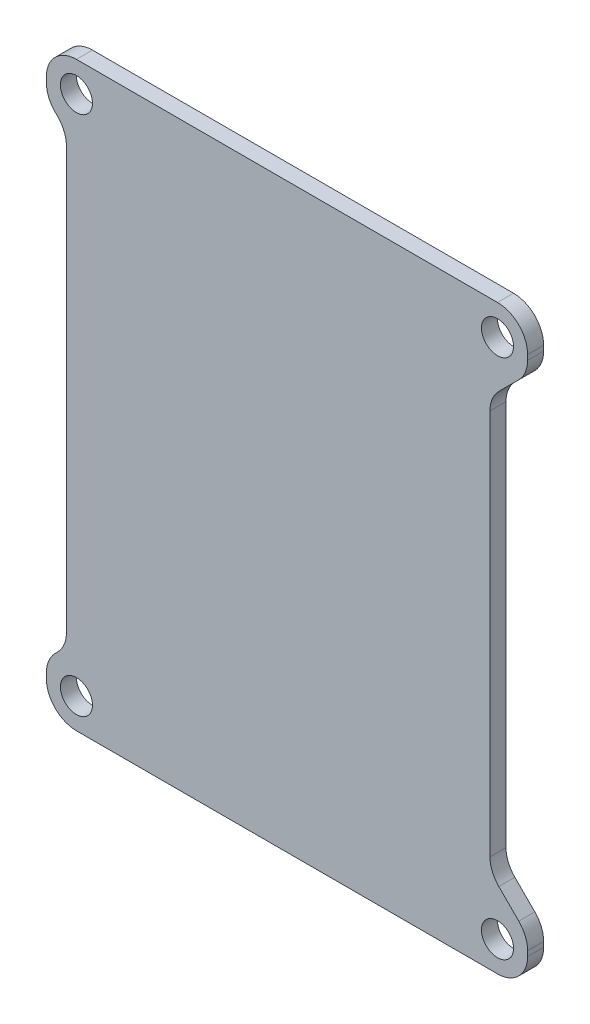
ISO-10303-21;
HEADER;
FILE_DESCRIPTION(('STEP AP214'),'2;1');
FILE_NAME('part.step','',(''),(''),'','','');
FILE_SCHEMA(('AUTOMOTIVE_DESIGN { 1 0 10303 214 1 1 1 1 }'));
ENDSEC;
DATA;
#1=APPLICATION_CONTEXT('core data for automotive mechanical design processes');
#2=APPLICATION_PROTOCOL_DEFINITION('international standard','automotive_design',2000,#1);
#3=PRODUCT_CONTEXT('',#1,'mechanical');
#4=PRODUCT('Part','Part','',(#3));
#5=PRODUCT_RELATED_PRODUCT_CATEGORY('part','',(#4));
#6=PRODUCT_DEFINITION_FORMATION('','',#4);
#7=PRODUCT_DEFINITION_CONTEXT('part definition',#1,'design');
#8=PRODUCT_DEFINITION('design','',#6,#7);
#9=PRODUCT_DEFINITION_SHAPE('','',#8);
#10=(LENGTH_UNIT() NAMED_UNIT(*) SI_UNIT(.MILLI.,.METRE.));
#11=(NAMED_UNIT(*) PLANE_ANGLE_UNIT() SI_UNIT($,.RADIAN.));
#12=(NAMED_UNIT(*) SI_UNIT($,.STERADIAN.) SOLID_ANGLE_UNIT());
#13=UNCERTAINTY_MEASURE_WITH_UNIT(LENGTH_MEASURE(1.E-05),#10,'distance_accuracy_value','');
#14=(GEOMETRIC_REPRESENTATION_CONTEXT(3) GLOBAL_UNCERTAINTY_ASSIGNED_CONTEXT((#13)) GLOBAL_UNIT_ASSIGNED_CONTEXT((#10,
#11,#12)) REPRESENTATION_CONTEXT('',''));
#15=CARTESIAN_POINT('',(0.,0.,0.));
#16=DIRECTION('',(0.,0.,1.));
#17=DIRECTION('',(1.,0.,0.));
#18=AXIS2_PLACEMENT_3D('',#15,#16,#17);
#19=CARTESIAN_POINT('',(-21.,26.,1.6));
#20=DIRECTION('',(0.,0.,-1.));
#21=DIRECTION('',(-1.,0.,0.));
#22=AXIS2_PLACEMENT_3D('',#19,#20,#21);
#23=PLANE('',#22);
#24=CARTESIAN_POINT('',(-21.,26.,1.6));
#25=DIRECTION('',(0.,0.,1.));
#26=DIRECTION('',(-1.,0.,0.));
#27=AXIS2_PLACEMENT_3D('',#24,#25,#26);
#28=CIRCLE('',#27,3.);
#29=CARTESIAN_POINT('',(-21.,29.,1.6));
#30=VERTEX_POINT('',#29);
#31=CARTESIAN_POINT('',(-24.,26.,1.6));
#32=VERTEX_POINT('',#31);
#33=EDGE_CURVE('E279',#30,#32,#28,.T.);
#34=ORIENTED_EDGE('',*,*,#33,.T.);
#35=DIRECTION('',(0.,-1.,0.));
#36=VECTOR('',#35,1.);
#37=CARTESIAN_POINT('',(-24.,26.,1.6));
#38=LINE('',#37,#36);
#39=CARTESIAN_POINT('',(-24.,25.5,1.6));
#40=VERTEX_POINT('',#39);
#41=EDGE_CURVE('E147',#32,#40,#38,.T.);
#42=ORIENTED_EDGE('',*,*,#41,.T.);
#43=CARTESIAN_POINT('',(-21.,25.5,1.6));
#44=DIRECTION('',(0.,0.,1.));
#45=DIRECTION('',(-1.,0.,0.));
#46=AXIS2_PLACEMENT_3D('',#43,#44,#45);
#47=CIRCLE('',#46,3.);
#48=CARTESIAN_POINT('',(-23.1213203435596,23.3786796564403,1.6));
#49=VERTEX_POINT('',#48);
#50=EDGE_CURVE('E342',#40,#49,#47,.T.);
#51=ORIENTED_EDGE('',*,*,#50,.T.);
#52=DIRECTION('',(0.707106781186558,-0.707106781186537,0.));
#53=VECTOR('',#52,1.);
#54=CARTESIAN_POINT('',(-23.1213203435596,23.3786796564403,1.6));
#55=LINE('',#54,#53);
#56=CARTESIAN_POINT('',(-22.8786796564404,23.1360389693211,1.6));
#57=VERTEX_POINT('',#56);
#58=EDGE_CURVE('E361',#49,#57,#55,.T.);
#59=ORIENTED_EDGE('',*,*,#58,.T.);
#60=CARTESIAN_POINT('',(-25.,21.0147186257614,1.6));
#61=DIRECTION('',(0.,0.,-1.));
#62=DIRECTION('',(-1.,0.,0.));
#63=AXIS2_PLACEMENT_3D('',#60,#61,#62);
#64=CIRCLE('',#63,3.);
#65=CARTESIAN_POINT('',(-22.,21.0147186257614,1.6));
#66=VERTEX_POINT('',#65);
#67=EDGE_CURVE('E358',#57,#66,#64,.T.);
#68=ORIENTED_EDGE('',*,*,#67,.T.);
#69=DIRECTION('',(0.,-1.,0.));
#70=VECTOR('',#69,1.);
#71=CARTESIAN_POINT('',(-22.,21.0147186257614,1.6));
#72=LINE('',#71,#70);
#73=CARTESIAN_POINT('',(-22.,-21.0147186257614,1.6));
#74=VERTEX_POINT('',#73);
#75=EDGE_CURVE('E360',#66,#74,#72,.T.);
#76=ORIENTED_EDGE('',*,*,#75,.T.);
#77=CARTESIAN_POINT('',(-25.,-21.0147186257614,1.6));
#78=DIRECTION('',(0.,0.,-1.));
#79=DIRECTION('',(1.,0.,0.));
#80=AXIS2_PLACEMENT_3D('',#77,#78,#79);
#81=CIRCLE('',#80,3.);
#82=CARTESIAN_POINT('',(-22.8786796564403,-23.136038969321,1.6));
#83=VERTEX_POINT('',#82);
#84=EDGE_CURVE('E363',#74,#83,#81,.T.);
#85=ORIENTED_EDGE('',*,*,#84,.T.);
#86=DIRECTION('',(-0.707106781186547,-0.707106781186547,0.));
#87=VECTOR('',#86,1.);
#88=CARTESIAN_POINT('',(-22.8786796564403,-23.136038969321,1.6));
#89=LINE('',#88,#87);
#90=CARTESIAN_POINT('',(-23.1213203435597,-23.3786796564404,1.6));
#91=VERTEX_POINT('',#90);
#92=EDGE_CURVE('E369',#83,#91,#89,.T.);
#93=ORIENTED_EDGE('',*,*,#92,.T.);
#94=CARTESIAN_POINT('',(-21.,-25.5,1.6));
#95=DIRECTION('',(0.,0.,1.));
#96=DIRECTION('',(1.,0.,0.));
#97=AXIS2_PLACEMENT_3D('',#94,#95,#96);
#98=CIRCLE('',#97,3.);
#99=CARTESIAN_POINT('',(-24.,-25.5,1.6));
#100=VERTEX_POINT('',#99);
#101=EDGE_CURVE('E371',#91,#100,#98,.T.);
#102=ORIENTED_EDGE('',*,*,#101,.T.);
#103=DIRECTION('',(0.,-1.,0.));
#104=VECTOR('',#103,1.);
#105=CARTESIAN_POINT('',(-24.,-25.5,1.6));
#106=LINE('',#105,#104);
#107=CARTESIAN_POINT('',(-24.,-26.,1.6));
#108=VERTEX_POINT('',#107);
#109=EDGE_CURVE('E373',#100,#108,#106,.T.);
#110=ORIENTED_EDGE('',*,*,#109,.T.);
#111=CARTESIAN_POINT('',(-21.,-26.,1.6));
#112=DIRECTION('',(0.,0.,1.));
#113=DIRECTION('',(1.,0.,0.));
#114=AXIS2_PLACEMENT_3D('',#111,#112,#113);
#115=CIRCLE('',#114,3.);
#116=CARTESIAN_POINT('',(-21.,-29.,1.6));
#117=VERTEX_POINT('',#116);
#118=EDGE_CURVE('E375',#108,#117,#115,.T.);
#119=ORIENTED_EDGE('',*,*,#118,.T.);
#120=DIRECTION('',(1.,0.,0.));
#121=VECTOR('',#120,1.);
#122=CARTESIAN_POINT('',(-21.,-29.,1.6));
#123=LINE('',#122,#121);
#124=CARTESIAN_POINT('',(21.,-29.,1.6));
#125=VERTEX_POINT('',#124);
#126=EDGE_CURVE('E377',#117,#125,#123,.T.);
#127=ORIENTED_EDGE('',*,*,#126,.T.);
#128=CARTESIAN_POINT('',(21.,-26.,1.6));
#129=DIRECTION('',(0.,0.,1.));
#130=DIRECTION('',(1.,0.,0.));
#131=AXIS2_PLACEMENT_3D('',#128,#129,#130);
#132=CIRCLE('',#131,3.);
#133=CARTESIAN_POINT('',(24.,-26.,1.6));
#134=VERTEX_POINT('',#133);
#135=EDGE_CURVE('E379',#125,#134,#132,.T.);
#136=ORIENTED_EDGE('',*,*,#135,.T.);
#137=DIRECTION('',(0.,1.,0.));
#138=VECTOR('',#137,1.);
#139=CARTESIAN_POINT('',(24.,-25.5,1.6));
#140=LINE('',#139,#138);
#141=CARTESIAN_POINT('',(24.,-25.5,1.6));
#142=VERTEX_POINT('',#141);
#143=EDGE_CURVE('E381',#134,#142,#140,.T.);
#144=ORIENTED_EDGE('',*,*,#143,.T.);
#145=CARTESIAN_POINT('',(21.,-25.5,1.6));
#146=DIRECTION('',(0.,0.,1.));
#147=DIRECTION('',(1.,0.,0.));
#148=AXIS2_PLACEMENT_3D('',#145,#146,#147);
#149=CIRCLE('',#148,3.);
#150=CARTESIAN_POINT('',(23.1213203435596,-23.3786796564404,1.6));
#151=VERTEX_POINT('',#150);
#152=EDGE_CURVE('E383',#142,#151,#149,.T.);
#153=ORIENTED_EDGE('',*,*,#152,.T.);
#154=DIRECTION('',(-0.707106781186546,0.707106781186549,0.));
#155=VECTOR('',#154,1.);
#156=CARTESIAN_POINT('',(21.1286796564404,-21.3860389693211,1.6));
#157=LINE('',#156,#155);
#158=CARTESIAN_POINT('',(21.1286796564404,-21.3860389693211,1.6));
#159=VERTEX_POINT('',#158);
#160=EDGE_CURVE('E385',#151,#159,#157,.T.);
#161=ORIENTED_EDGE('',*,*,#160,.T.);
#162=CARTESIAN_POINT('',(23.25,-19.2647186257614,1.6));
#163=DIRECTION('',(0.,0.,-1.));
#164=DIRECTION('',(1.,0.,0.));
#165=AXIS2_PLACEMENT_3D('',#162,#163,#164);
#166=CIRCLE('',#165,3.);
#167=CARTESIAN_POINT('',(20.25,-19.2647186257614,1.6));
#168=VERTEX_POINT('',#167);
#169=EDGE_CURVE('E387',#159,#168,#166,.T.);
#170=ORIENTED_EDGE('',*,*,#169,.T.);
#171=DIRECTION('',(0.,1.,0.));
#172=VECTOR('',#171,1.);
#173=CARTESIAN_POINT('',(20.25,19.2647186257614,1.6));
#174=LINE('',#173,#172);
#175=CARTESIAN_POINT('',(20.25,19.2647186257614,1.6));
#176=VERTEX_POINT('',#175);
#177=EDGE_CURVE('E389',#168,#176,#174,.T.);
#178=ORIENTED_EDGE('',*,*,#177,.T.);
#179=CARTESIAN_POINT('',(23.25,19.2647186257615,1.6));
#180=DIRECTION('',(0.,0.,-1.));
#181=DIRECTION('',(1.,0.,0.));
#182=AXIS2_PLACEMENT_3D('',#179,#180,#181);
#183=CIRCLE('',#182,3.);
#184=CARTESIAN_POINT('',(21.1286796564404,21.3860389693211,1.6));
#185=VERTEX_POINT('',#184);
#186=EDGE_CURVE('E391',#176,#185,#183,.T.);
#187=ORIENTED_EDGE('',*,*,#186,.T.);
#188=DIRECTION('',(0.707106781186551,0.707106781186544,0.));
#189=VECTOR('',#188,1.);
#190=CARTESIAN_POINT('',(23.1213203435596,23.3786796564403,1.6));
#191=LINE('',#190,#189);
#192=CARTESIAN_POINT('',(23.1213203435596,23.3786796564403,1.6));
#193=VERTEX_POINT('',#192);
#194=EDGE_CURVE('E393',#185,#193,#191,.T.);
#195=ORIENTED_EDGE('',*,*,#194,.T.);
#196=CARTESIAN_POINT('',(21.,25.5,1.6));
#197=DIRECTION('',(0.,0.,1.));
#198=DIRECTION('',(-1.,0.,0.));
#199=AXIS2_PLACEMENT_3D('',#196,#197,#198);
#200=CIRCLE('',#199,3.);
#201=CARTESIAN_POINT('',(24.,25.5,1.6));
#202=VERTEX_POINT('',#201);
#203=EDGE_CURVE('E214',#193,#202,#200,.T.);
#204=ORIENTED_EDGE('',*,*,#203,.T.);
#205=DIRECTION('',(0.,1.,0.));
#206=VECTOR('',#205,1.);
#207=CARTESIAN_POINT('',(24.,26.,1.6));
#208=LINE('',#207,#206);
#209=CARTESIAN_POINT('',(24.,26.,1.6));
#210=VERTEX_POINT('',#209);
#211=EDGE_CURVE('E208',#202,#210,#208,.T.);
#212=ORIENTED_EDGE('',*,*,#211,.T.);
#213=CARTESIAN_POINT('',(21.,26.,1.6));
#214=DIRECTION('',(0.,0.,1.));
#215=DIRECTION('',(-1.,0.,0.));
#216=AXIS2_PLACEMENT_3D('',#213,#214,#215);
#217=CIRCLE('',#216,3.);
#218=CARTESIAN_POINT('',(21.,29.,1.6));
#219=VERTEX_POINT('',#218);
#220=EDGE_CURVE('E212',#210,#219,#217,.T.);
#221=ORIENTED_EDGE('',*,*,#220,.T.);
#222=DIRECTION('',(-1.,0.,0.));
#223=VECTOR('',#222,1.);
#224=CARTESIAN_POINT('',(-21.,29.,1.6));
#225=LINE('',#224,#223);
#226=EDGE_CURVE('E56',#219,#30,#225,.T.);
#227=ORIENTED_EDGE('',*,*,#226,.T.);
#228=EDGE_LOOP('',(#34,#42,#51,#59,#68,#76,#85,#93,#102,#110,#119,#127,#136,#144,#153,#161,#170,
#178,#187,#195,#204,#212,#221,#227));
#229=FACE_BOUND('',#228,.T.);
#230=CARTESIAN_POINT('',(-21.,26.,1.6));
#231=DIRECTION('',(0.,0.,1.));
#232=DIRECTION('',(1.,0.,0.));
#233=AXIS2_PLACEMENT_3D('',#230,#231,#232);
#234=CIRCLE('',#233,1.6);
#235=CARTESIAN_POINT('',(-19.4,26.,1.6));
#236=VERTEX_POINT('',#235);
#237=EDGE_CURVE('E236',#236,#236,#234,.T.);
#238=ORIENTED_EDGE('',*,*,#237,.F.);
#239=EDGE_LOOP('',(#238));
#240=FACE_BOUND('',#239,.T.);
#241=CARTESIAN_POINT('',(21.,26.,1.6));
#242=DIRECTION('',(0.,0.,1.));
#243=DIRECTION('',(1.,0.,0.));
#244=AXIS2_PLACEMENT_3D('',#241,#242,#243);
#245=CIRCLE('',#244,1.6);
#246=CARTESIAN_POINT('',(22.6,26.,1.6));
#247=VERTEX_POINT('',#246);
#248=EDGE_CURVE('E457',#247,#247,#245,.T.);
#249=ORIENTED_EDGE('',*,*,#248,.F.);
#250=EDGE_LOOP('',(#249));
#251=FACE_BOUND('',#250,.T.);
#252=CARTESIAN_POINT('',(21.,-26.,1.6));
#253=DIRECTION('',(0.,0.,1.));
#254=DIRECTION('',(1.,0.,0.));
#255=AXIS2_PLACEMENT_3D('',#252,#253,#254);
#256=CIRCLE('',#255,1.6);
#257=CARTESIAN_POINT('',(22.6,-26.,1.6));
#258=VERTEX_POINT('',#257);
#259=EDGE_CURVE('E451',#258,#258,#256,.T.);
#260=ORIENTED_EDGE('',*,*,#259,.F.);
#261=EDGE_LOOP('',(#260));
#262=FACE_BOUND('',#261,.T.);
#263=CARTESIAN_POINT('',(-21.,-26.,1.6));
#264=DIRECTION('',(0.,0.,1.));
#265=DIRECTION('',(1.,0.,0.));
#266=AXIS2_PLACEMENT_3D('',#263,#264,#265);
#267=CIRCLE('',#266,1.6);
#268=CARTESIAN_POINT('',(-19.4,-26.,1.6));
#269=VERTEX_POINT('',#268);
#270=EDGE_CURVE('E442',#269,#269,#267,.T.);
#271=ORIENTED_EDGE('',*,*,#270,.F.);
#272=EDGE_LOOP('',(#271));
#273=FACE_BOUND('',#272,.T.);
#274=ADVANCED_FACE('F39',(#229,#240,#251,#262,#273),#23,.F.);
#275=CARTESIAN_POINT('',(-21.,26.,0.));
#276=DIRECTION('',(0.,0.,-1.));
#277=DIRECTION('',(-1.,0.,0.));
#278=AXIS2_PLACEMENT_3D('',#275,#276,#277);
#279=PLANE('',#278);
#280=CARTESIAN_POINT('',(21.,-26.,0.));
#281=DIRECTION('',(0.,0.,1.));
#282=DIRECTION('',(1.,0.,0.));
#283=AXIS2_PLACEMENT_3D('',#280,#281,#282);
#284=CIRCLE('',#283,1.6);
#285=CARTESIAN_POINT('',(22.6,-26.,0.));
#286=VERTEX_POINT('',#285);
#287=EDGE_CURVE('E448',#286,#286,#284,.T.);
#288=ORIENTED_EDGE('',*,*,#287,.T.);
#289=EDGE_LOOP('',(#288));
#290=FACE_BOUND('',#289,.T.);
#291=CARTESIAN_POINT('',(-21.,26.,0.));
#292=DIRECTION('',(0.,0.,1.));
#293=DIRECTION('',(1.,0.,0.));
#294=AXIS2_PLACEMENT_3D('',#291,#292,#293);
#295=CIRCLE('',#294,1.6);
#296=CARTESIAN_POINT('',(-19.4,26.,0.));
#297=VERTEX_POINT('',#296);
#298=EDGE_CURVE('E460',#297,#297,#295,.T.);
#299=ORIENTED_EDGE('',*,*,#298,.T.);
#300=EDGE_LOOP('',(#299));
#301=FACE_BOUND('',#300,.T.);
#302=CARTESIAN_POINT('',(-21.,26.,0.));
#303=DIRECTION('',(0.,0.,1.));
#304=DIRECTION('',(-1.,0.,0.));
#305=AXIS2_PLACEMENT_3D('',#302,#303,#304);
#306=CIRCLE('',#305,3.);
#307=CARTESIAN_POINT('',(-21.,29.,0.));
#308=VERTEX_POINT('',#307);
#309=CARTESIAN_POINT('',(-24.,26.,0.));
#310=VERTEX_POINT('',#309);
#311=EDGE_CURVE('E232',#308,#310,#306,.T.);
#312=ORIENTED_EDGE('',*,*,#311,.F.);
#313=DIRECTION('',(-1.,0.,0.));
#314=VECTOR('',#313,1.);
#315=CARTESIAN_POINT('',(-21.,29.,0.));
#316=LINE('',#315,#314);
#317=CARTESIAN_POINT('',(21.,29.,0.));
#318=VERTEX_POINT('',#317);
#319=EDGE_CURVE('E139',#318,#308,#316,.T.);
#320=ORIENTED_EDGE('',*,*,#319,.F.);
#321=CARTESIAN_POINT('',(21.,26.,0.));
#322=DIRECTION('',(0.,0.,1.));
#323=DIRECTION('',(-1.,0.,0.));
#324=AXIS2_PLACEMENT_3D('',#321,#322,#323);
#325=CIRCLE('',#324,3.);
#326=CARTESIAN_POINT('',(24.,26.,0.));
#327=VERTEX_POINT('',#326);
#328=EDGE_CURVE('E133',#327,#318,#325,.T.);
#329=ORIENTED_EDGE('',*,*,#328,.F.);
#330=DIRECTION('',(0.,1.,0.));
#331=VECTOR('',#330,1.);
#332=CARTESIAN_POINT('',(24.,26.,0.));
#333=LINE('',#332,#331);
#334=CARTESIAN_POINT('',(24.,25.5,0.));
#335=VERTEX_POINT('',#334);
#336=EDGE_CURVE('E222',#335,#327,#333,.T.);
#337=ORIENTED_EDGE('',*,*,#336,.F.);
#338=CARTESIAN_POINT('',(21.,25.5,0.));
#339=DIRECTION('',(0.,0.,1.));
#340=DIRECTION('',(-1.,0.,0.));
#341=AXIS2_PLACEMENT_3D('',#338,#339,#340);
#342=CIRCLE('',#341,3.);
#343=CARTESIAN_POINT('',(23.1213203435596,23.3786796564403,0.));
#344=VERTEX_POINT('',#343);
#345=EDGE_CURVE('E274',#344,#335,#342,.T.);
#346=ORIENTED_EDGE('',*,*,#345,.F.);
#347=DIRECTION('',(0.707106781186551,0.707106781186544,0.));
#348=VECTOR('',#347,1.);
#349=CARTESIAN_POINT('',(23.1213203435596,23.3786796564403,0.));
#350=LINE('',#349,#348);
#351=CARTESIAN_POINT('',(21.1286796564404,21.3860389693211,0.));
#352=VERTEX_POINT('',#351);
#353=EDGE_CURVE('E272',#352,#344,#350,.T.);
#354=ORIENTED_EDGE('',*,*,#353,.F.);
#355=CARTESIAN_POINT('',(23.25,19.2647186257615,0.));
#356=DIRECTION('',(0.,0.,-1.));
#357=DIRECTION('',(1.,0.,0.));
#358=AXIS2_PLACEMENT_3D('',#355,#356,#357);
#359=CIRCLE('',#358,3.);
#360=CARTESIAN_POINT('',(20.25,19.2647186257614,0.));
#361=VERTEX_POINT('',#360);
#362=EDGE_CURVE('E270',#361,#352,#359,.T.);
#363=ORIENTED_EDGE('',*,*,#362,.F.);
#364=DIRECTION('',(0.,1.,0.));
#365=VECTOR('',#364,1.);
#366=CARTESIAN_POINT('',(20.25,19.2647186257614,0.));
#367=LINE('',#366,#365);
#368=CARTESIAN_POINT('',(20.25,-19.2647186257614,0.));
#369=VERTEX_POINT('',#368);
#370=EDGE_CURVE('E268',#369,#361,#367,.T.);
#371=ORIENTED_EDGE('',*,*,#370,.F.);
#372=CARTESIAN_POINT('',(23.25,-19.2647186257614,0.));
#373=DIRECTION('',(0.,0.,-1.));
#374=DIRECTION('',(1.,0.,0.));
#375=AXIS2_PLACEMENT_3D('',#372,#373,#374);
#376=CIRCLE('',#375,3.);
#377=CARTESIAN_POINT('',(21.1286796564404,-21.3860389693211,0.));
#378=VERTEX_POINT('',#377);
#379=EDGE_CURVE('E266',#378,#369,#376,.T.);
#380=ORIENTED_EDGE('',*,*,#379,.F.);
#381=DIRECTION('',(-0.707106781186546,0.707106781186549,0.));
#382=VECTOR('',#381,1.);
#383=CARTESIAN_POINT('',(21.1286796564404,-21.3860389693211,0.));
#384=LINE('',#383,#382);
#385=CARTESIAN_POINT('',(23.1213203435596,-23.3786796564404,0.));
#386=VERTEX_POINT('',#385);
#387=EDGE_CURVE('E264',#386,#378,#384,.T.);
#388=ORIENTED_EDGE('',*,*,#387,.F.);
#389=CARTESIAN_POINT('',(21.,-25.5,0.));
#390=DIRECTION('',(0.,0.,1.));
#391=DIRECTION('',(1.,0.,0.));
#392=AXIS2_PLACEMENT_3D('',#389,#390,#391);
#393=CIRCLE('',#392,3.);
#394=CARTESIAN_POINT('',(24.,-25.5,0.));
#395=VERTEX_POINT('',#394);
#396=EDGE_CURVE('E262',#395,#386,#393,.T.);
#397=ORIENTED_EDGE('',*,*,#396,.F.);
#398=DIRECTION('',(0.,1.,0.));
#399=VECTOR('',#398,1.);
#400=CARTESIAN_POINT('',(24.,-25.5,0.));
#401=LINE('',#400,#399);
#402=CARTESIAN_POINT('',(24.,-26.,0.));
#403=VERTEX_POINT('',#402);
#404=EDGE_CURVE('E260',#403,#395,#401,.T.);
#405=ORIENTED_EDGE('',*,*,#404,.F.);
#406=CARTESIAN_POINT('',(21.,-26.,0.));
#407=DIRECTION('',(0.,0.,1.));
#408=DIRECTION('',(1.,0.,0.));
#409=AXIS2_PLACEMENT_3D('',#406,#407,#408);
#410=CIRCLE('',#409,3.);
#411=CARTESIAN_POINT('',(21.,-29.,0.));
#412=VERTEX_POINT('',#411);
#413=EDGE_CURVE('E258',#412,#403,#410,.T.);
#414=ORIENTED_EDGE('',*,*,#413,.F.);
#415=DIRECTION('',(1.,0.,0.));
#416=VECTOR('',#415,1.);
#417=CARTESIAN_POINT('',(-21.,-29.,0.));
#418=LINE('',#417,#416);
#419=CARTESIAN_POINT('',(-21.,-29.,0.));
#420=VERTEX_POINT('',#419);
#421=EDGE_CURVE('E256',#420,#412,#418,.T.);
#422=ORIENTED_EDGE('',*,*,#421,.F.);
#423=CARTESIAN_POINT('',(-21.,-26.,0.));
#424=DIRECTION('',(0.,0.,1.));
#425=DIRECTION('',(1.,0.,0.));
#426=AXIS2_PLACEMENT_3D('',#423,#424,#425);
#427=CIRCLE('',#426,3.);
#428=CARTESIAN_POINT('',(-24.,-26.,0.));
#429=VERTEX_POINT('',#428);
#430=EDGE_CURVE('E254',#429,#420,#427,.T.);
#431=ORIENTED_EDGE('',*,*,#430,.F.);
#432=DIRECTION('',(0.,-1.,0.));
#433=VECTOR('',#432,1.);
#434=CARTESIAN_POINT('',(-24.,-25.5,0.));
#435=LINE('',#434,#433);
#436=CARTESIAN_POINT('',(-24.,-25.5,0.));
#437=VERTEX_POINT('',#436);
#438=EDGE_CURVE('E252',#437,#429,#435,.T.);
#439=ORIENTED_EDGE('',*,*,#438,.F.);
#440=CARTESIAN_POINT('',(-21.,-25.5,0.));
#441=DIRECTION('',(0.,0.,1.));
#442=DIRECTION('',(1.,0.,0.));
#443=AXIS2_PLACEMENT_3D('',#440,#441,#442);
#444=CIRCLE('',#443,3.);
#445=CARTESIAN_POINT('',(-23.1213203435597,-23.3786796564404,0.));
#446=VERTEX_POINT('',#445);
#447=EDGE_CURVE('E250',#446,#437,#444,.T.);
#448=ORIENTED_EDGE('',*,*,#447,.F.);
#449=DIRECTION('',(-0.707106781186547,-0.707106781186547,0.));
#450=VECTOR('',#449,1.);
#451=CARTESIAN_POINT('',(-22.8786796564403,-23.136038969321,0.));
#452=LINE('',#451,#450);
#453=CARTESIAN_POINT('',(-22.8786796564403,-23.136038969321,0.));
#454=VERTEX_POINT('',#453);
#455=EDGE_CURVE('E248',#454,#446,#452,.T.);
#456=ORIENTED_EDGE('',*,*,#455,.F.);
#457=CARTESIAN_POINT('',(-25.,-21.0147186257614,0.));
#458=DIRECTION('',(0.,0.,-1.));
#459=DIRECTION('',(1.,0.,0.));
#460=AXIS2_PLACEMENT_3D('',#457,#458,#459);
#461=CIRCLE('',#460,3.);
#462=CARTESIAN_POINT('',(-22.,-21.0147186257614,0.));
#463=VERTEX_POINT('',#462);
#464=EDGE_CURVE('E246',#463,#454,#461,.T.);
#465=ORIENTED_EDGE('',*,*,#464,.F.);
#466=DIRECTION('',(0.,-1.,0.));
#467=VECTOR('',#466,1.);
#468=CARTESIAN_POINT('',(-22.,21.0147186257614,0.));
#469=LINE('',#468,#467);
#470=CARTESIAN_POINT('',(-22.,21.0147186257614,0.));
#471=VERTEX_POINT('',#470);
#472=EDGE_CURVE('E244',#471,#463,#469,.T.);
#473=ORIENTED_EDGE('',*,*,#472,.F.);
#474=CARTESIAN_POINT('',(-25.,21.0147186257614,0.));
#475=DIRECTION('',(0.,0.,-1.));
#476=DIRECTION('',(-1.,0.,0.));
#477=AXIS2_PLACEMENT_3D('',#474,#475,#476);
#478=CIRCLE('',#477,3.);
#479=CARTESIAN_POINT('',(-22.8786796564404,23.1360389693211,0.));
#480=VERTEX_POINT('',#479);
#481=EDGE_CURVE('E242',#480,#471,#478,.T.);
#482=ORIENTED_EDGE('',*,*,#481,.F.);
#483=DIRECTION('',(0.707106781186558,-0.707106781186537,0.));
#484=VECTOR('',#483,1.);
#485=CARTESIAN_POINT('',(-23.1213203435596,23.3786796564403,0.));
#486=LINE('',#485,#484);
#487=CARTESIAN_POINT('',(-23.1213203435596,23.3786796564403,0.));
#488=VERTEX_POINT('',#487);
#489=EDGE_CURVE('E240',#488,#480,#486,.T.);
#490=ORIENTED_EDGE('',*,*,#489,.F.);
#491=CARTESIAN_POINT('',(-21.,25.5,0.));
#492=DIRECTION('',(0.,0.,1.));
#493=DIRECTION('',(-1.,0.,0.));
#494=AXIS2_PLACEMENT_3D('',#491,#492,#493);
#495=CIRCLE('',#494,3.);
#496=CARTESIAN_POINT('',(-24.,25.5,0.));
#497=VERTEX_POINT('',#496);
#498=EDGE_CURVE('E238',#497,#488,#495,.T.);
#499=ORIENTED_EDGE('',*,*,#498,.F.);
#500=DIRECTION('',(0.,-1.,0.));
#501=VECTOR('',#500,1.);
#502=CARTESIAN_POINT('',(-24.,26.,0.));
#503=LINE('',#502,#501);
#504=EDGE_CURVE('E235',#310,#497,#503,.T.);
#505=ORIENTED_EDGE('',*,*,#504,.F.);
#506=EDGE_LOOP('',(#312,#320,#329,#337,#346,#354,#363,#371,#380,#388,#397,#405,#414,#422,#431,
#439,#448,#456,#465,#473,#482,#490,#499,#505));
#507=FACE_BOUND('',#506,.T.);
#508=CARTESIAN_POINT('',(21.,26.,0.));
#509=DIRECTION('',(0.,0.,1.));
#510=DIRECTION('',(1.,0.,0.));
#511=AXIS2_PLACEMENT_3D('',#508,#509,#510);
#512=CIRCLE('',#511,1.6);
#513=CARTESIAN_POINT('',(22.6,26.,0.));
#514=VERTEX_POINT('',#513);
#515=EDGE_CURVE('E454',#514,#514,#512,.T.);
#516=ORIENTED_EDGE('',*,*,#515,.T.);
#517=EDGE_LOOP('',(#516));
#518=FACE_BOUND('',#517,.T.);
#519=CARTESIAN_POINT('',(-21.,-26.,0.));
#520=DIRECTION('',(0.,0.,1.));
#521=DIRECTION('',(1.,0.,0.));
#522=AXIS2_PLACEMENT_3D('',#519,#520,#521);
#523=CIRCLE('',#522,1.6);
#524=CARTESIAN_POINT('',(-19.4,-26.,0.));
#525=VERTEX_POINT('',#524);
#526=EDGE_CURVE('E445',#525,#525,#523,.T.);
#527=ORIENTED_EDGE('',*,*,#526,.T.);
#528=EDGE_LOOP('',(#527));
#529=FACE_BOUND('',#528,.T.);
#530=ADVANCED_FACE('F346',(#290,#301,#507,#518,#529),#279,.T.);
#531=CARTESIAN_POINT('',(-21.,26.,1.6));
#532=DIRECTION('',(0.,0.,-1.));
#533=DIRECTION('',(-1.,0.,0.));
#534=AXIS2_PLACEMENT_3D('',#531,#532,#533);
#535=CYLINDRICAL_SURFACE('',#534,3.);
#536=ORIENTED_EDGE('',*,*,#311,.T.);
#537=DIRECTION('',(0.,0.,-1.));
#538=VECTOR('',#537,1.);
#539=CARTESIAN_POINT('',(-24.,26.,1.6));
#540=LINE('',#539,#538);
#541=EDGE_CURVE('E11',#32,#310,#540,.T.);
#542=ORIENTED_EDGE('',*,*,#541,.F.);
#543=ORIENTED_EDGE('',*,*,#33,.F.);
#544=DIRECTION('',(0.,0.,-1.));
#545=VECTOR('',#544,1.);
#546=CARTESIAN_POINT('',(-21.,29.,1.6));
#547=LINE('',#546,#545);
#548=EDGE_CURVE('E228',#30,#308,#547,.T.);
#549=ORIENTED_EDGE('',*,*,#548,.T.);
#550=EDGE_LOOP('',(#536,#542,#543,#549));
#551=FACE_BOUND('',#550,.T.);
#552=ADVANCED_FACE('F41',(#551),#535,.T.);
#553=CARTESIAN_POINT('',(-24.,26.,1.6));
#554=DIRECTION('',(1.,0.,0.));
#555=DIRECTION('',(0.,0.,-1.));
#556=AXIS2_PLACEMENT_3D('',#553,#554,#555);
#557=PLANE('',#556);
#558=ORIENTED_EDGE('',*,*,#504,.T.);
#559=DIRECTION('',(0.,0.,-1.));
#560=VECTOR('',#559,1.);
#561=CARTESIAN_POINT('',(-24.,25.5,1.6));
#562=LINE('',#561,#560);
#563=EDGE_CURVE('E48',#40,#497,#562,.T.);
#564=ORIENTED_EDGE('',*,*,#563,.F.);
#565=ORIENTED_EDGE('',*,*,#41,.F.);
#566=ORIENTED_EDGE('',*,*,#541,.T.);
#567=EDGE_LOOP('',(#558,#564,#565,#566));
#568=FACE_BOUND('',#567,.T.);
#569=ADVANCED_FACE('F692',(#568),#557,.F.);
#570=CARTESIAN_POINT('',(-21.,25.5,1.6));
#571=DIRECTION('',(0.,0.,-1.));
#572=DIRECTION('',(-1.,0.,0.));
#573=AXIS2_PLACEMENT_3D('',#570,#571,#572);
#574=CYLINDRICAL_SURFACE('',#573,3.);
#575=ORIENTED_EDGE('',*,*,#498,.T.);
#576=DIRECTION('',(0.,0.,-1.));
#577=VECTOR('',#576,1.);
#578=CARTESIAN_POINT('',(-23.1213203435596,23.3786796564403,1.6));
#579=LINE('',#578,#577);
#580=EDGE_CURVE('E334',#49,#488,#579,.T.);
#581=ORIENTED_EDGE('',*,*,#580,.F.);
#582=ORIENTED_EDGE('',*,*,#50,.F.);
#583=ORIENTED_EDGE('',*,*,#563,.T.);
#584=EDGE_LOOP('',(#575,#581,#582,#583));
#585=FACE_BOUND('',#584,.T.);
#586=ADVANCED_FACE('F340',(#585),#574,.T.);
#587=CARTESIAN_POINT('',(-23.1213203435596,23.3786796564403,1.6));
#588=DIRECTION('',(0.707106781186537,0.707106781186558,0.));
#589=DIRECTION('',(-0.707106781186558,0.707106781186537,0.));
#590=AXIS2_PLACEMENT_3D('',#587,#588,#589);
#591=PLANE('',#590);
#592=ORIENTED_EDGE('',*,*,#489,.T.);
#593=DIRECTION('',(0.,0.,-1.));
#594=VECTOR('',#593,1.);
#595=CARTESIAN_POINT('',(-22.8786796564404,23.1360389693211,1.6));
#596=LINE('',#595,#594);
#597=EDGE_CURVE('E331',#57,#480,#596,.T.);
#598=ORIENTED_EDGE('',*,*,#597,.F.);
#599=ORIENTED_EDGE('',*,*,#58,.F.);
#600=ORIENTED_EDGE('',*,*,#580,.T.);
#601=EDGE_LOOP('',(#592,#598,#599,#600));
#602=FACE_BOUND('',#601,.T.);
#603=ADVANCED_FACE('F352',(#602),#591,.F.);
#604=CARTESIAN_POINT('',(-25.,21.0147186257614,1.6));
#605=DIRECTION('',(0.,0.,-1.));
#606=DIRECTION('',(-1.,0.,0.));
#607=AXIS2_PLACEMENT_3D('',#604,#605,#606);
#608=CYLINDRICAL_SURFACE('',#607,3.);
#609=ORIENTED_EDGE('',*,*,#481,.T.);
#610=DIRECTION('',(0.,0.,-1.));
#611=VECTOR('',#610,1.);
#612=CARTESIAN_POINT('',(-22.,21.0147186257614,1.6));
#613=LINE('',#612,#611);
#614=EDGE_CURVE('E328',#66,#471,#613,.T.);
#615=ORIENTED_EDGE('',*,*,#614,.F.);
#616=ORIENTED_EDGE('',*,*,#67,.F.);
#617=ORIENTED_EDGE('',*,*,#597,.T.);
#618=EDGE_LOOP('',(#609,#615,#616,#617));
#619=FACE_BOUND('',#618,.T.);
#620=ADVANCED_FACE('F356',(#619),#608,.F.);
#621=CARTESIAN_POINT('',(-22.,21.0147186257614,1.6));
#622=DIRECTION('',(1.,0.,0.));
#623=DIRECTION('',(0.,1.,0.));
#624=AXIS2_PLACEMENT_3D('',#621,#622,#623);
#625=PLANE('',#624);
#626=ORIENTED_EDGE('',*,*,#472,.T.);
#627=DIRECTION('',(0.,0.,-1.));
#628=VECTOR('',#627,1.);
#629=CARTESIAN_POINT('',(-22.,-21.0147186257614,1.6));
#630=LINE('',#629,#628);
#631=EDGE_CURVE('E325',#74,#463,#630,.T.);
#632=ORIENTED_EDGE('',*,*,#631,.F.);
#633=ORIENTED_EDGE('',*,*,#75,.F.);
#634=ORIENTED_EDGE('',*,*,#614,.T.);
#635=EDGE_LOOP('',(#626,#632,#633,#634));
#636=FACE_BOUND('',#635,.T.);
#637=ADVANCED_FACE('F657',(#636),#625,.F.);
#638=CARTESIAN_POINT('',(-25.,-21.0147186257614,1.6));
#639=DIRECTION('',(0.,0.,-1.));
#640=DIRECTION('',(-1.,0.,0.));
#641=AXIS2_PLACEMENT_3D('',#638,#639,#640);
#642=CYLINDRICAL_SURFACE('',#641,3.);
#643=ORIENTED_EDGE('',*,*,#464,.T.);
#644=DIRECTION('',(0.,0.,-1.));
#645=VECTOR('',#644,1.);
#646=CARTESIAN_POINT('',(-22.8786796564403,-23.136038969321,1.6));
#647=LINE('',#646,#645);
#648=EDGE_CURVE('E322',#83,#454,#647,.T.);
#649=ORIENTED_EDGE('',*,*,#648,.F.);
#650=ORIENTED_EDGE('',*,*,#84,.F.);
#651=ORIENTED_EDGE('',*,*,#631,.T.);
#652=EDGE_LOOP('',(#643,#649,#650,#651));
#653=FACE_BOUND('',#652,.T.);
#654=ADVANCED_FACE('F647',(#653),#642,.F.);
#655=CARTESIAN_POINT('',(-22.8786796564403,-23.136038969321,1.6));
#656=DIRECTION('',(0.707106781186548,-0.707106781186548,0.));
#657=DIRECTION('',(0.707106781186548,0.707106781186548,0.));
#658=AXIS2_PLACEMENT_3D('',#655,#656,#657);
#659=PLANE('',#658);
#660=ORIENTED_EDGE('',*,*,#455,.T.);
#661=DIRECTION('',(0.,0.,-1.));
#662=VECTOR('',#661,1.);
#663=CARTESIAN_POINT('',(-23.1213203435597,-23.3786796564404,1.6));
#664=LINE('',#663,#662);
#665=EDGE_CURVE('E319',#91,#446,#664,.T.);
#666=ORIENTED_EDGE('',*,*,#665,.F.);
#667=ORIENTED_EDGE('',*,*,#92,.F.);
#668=ORIENTED_EDGE('',*,*,#648,.T.);
#669=EDGE_LOOP('',(#660,#666,#667,#668));
#670=FACE_BOUND('',#669,.T.);
#671=ADVANCED_FACE('F637',(#670),#659,.F.);
#672=CARTESIAN_POINT('',(-21.,-25.5,1.6));
#673=DIRECTION('',(0.,0.,-1.));
#674=DIRECTION('',(-1.,0.,0.));
#675=AXIS2_PLACEMENT_3D('',#672,#673,#674);
#676=CYLINDRICAL_SURFACE('',#675,3.);
#677=ORIENTED_EDGE('',*,*,#447,.T.);
#678=DIRECTION('',(0.,0.,-1.));
#679=VECTOR('',#678,1.);
#680=CARTESIAN_POINT('',(-24.,-25.5,1.6));
#681=LINE('',#680,#679);
#682=EDGE_CURVE('E316',#100,#437,#681,.T.);
#683=ORIENTED_EDGE('',*,*,#682,.F.);
#684=ORIENTED_EDGE('',*,*,#101,.F.);
#685=ORIENTED_EDGE('',*,*,#665,.T.);
#686=EDGE_LOOP('',(#677,#683,#684,#685));
#687=FACE_BOUND('',#686,.T.);
#688=ADVANCED_FACE('F627',(#687),#676,.T.);
#689=CARTESIAN_POINT('',(-24.,-25.5,1.6));
#690=DIRECTION('',(1.,0.,0.));
#691=DIRECTION('',(0.,1.,0.));
#692=AXIS2_PLACEMENT_3D('',#689,#690,#691);
#693=PLANE('',#692);
#694=ORIENTED_EDGE('',*,*,#438,.T.);
#695=DIRECTION('',(0.,0.,-1.));
#696=VECTOR('',#695,1.);
#697=CARTESIAN_POINT('',(-24.,-26.,1.6));
#698=LINE('',#697,#696);
#699=EDGE_CURVE('E313',#108,#429,#698,.T.);
#700=ORIENTED_EDGE('',*,*,#699,.F.);
#701=ORIENTED_EDGE('',*,*,#109,.F.);
#702=ORIENTED_EDGE('',*,*,#682,.T.);
#703=EDGE_LOOP('',(#694,#700,#701,#702));
#704=FACE_BOUND('',#703,.T.);
#705=ADVANCED_FACE('F617',(#704),#693,.F.);
#706=CARTESIAN_POINT('',(-21.,-26.,1.6));
#707=DIRECTION('',(0.,0.,-1.));
#708=DIRECTION('',(-1.,0.,0.));
#709=AXIS2_PLACEMENT_3D('',#706,#707,#708);
#710=CYLINDRICAL_SURFACE('',#709,3.);
#711=ORIENTED_EDGE('',*,*,#430,.T.);
#712=DIRECTION('',(0.,0.,-1.));
#713=VECTOR('',#712,1.);
#714=CARTESIAN_POINT('',(-21.,-29.,1.6));
#715=LINE('',#714,#713);
#716=EDGE_CURVE('E310',#117,#420,#715,.T.);
#717=ORIENTED_EDGE('',*,*,#716,.F.);
#718=ORIENTED_EDGE('',*,*,#118,.F.);
#719=ORIENTED_EDGE('',*,*,#699,.T.);
#720=EDGE_LOOP('',(#711,#717,#718,#719));
#721=FACE_BOUND('',#720,.T.);
#722=ADVANCED_FACE('F607',(#721),#710,.T.);
#723=CARTESIAN_POINT('',(-21.,-29.,1.6));
#724=DIRECTION('',(0.,1.,0.));
#725=DIRECTION('',(0.,0.,1.));
#726=AXIS2_PLACEMENT_3D('',#723,#724,#725);
#727=PLANE('',#726);
#728=ORIENTED_EDGE('',*,*,#421,.T.);
#729=DIRECTION('',(0.,0.,-1.));
#730=VECTOR('',#729,1.);
#731=CARTESIAN_POINT('',(21.,-29.,1.6));
#732=LINE('',#731,#730);
#733=EDGE_CURVE('E307',#125,#412,#732,.T.);
#734=ORIENTED_EDGE('',*,*,#733,.F.);
#735=ORIENTED_EDGE('',*,*,#126,.F.);
#736=ORIENTED_EDGE('',*,*,#716,.T.);
#737=EDGE_LOOP('',(#728,#734,#735,#736));
#738=FACE_BOUND('',#737,.T.);
#739=ADVANCED_FACE('F597',(#738),#727,.F.);
#740=CARTESIAN_POINT('',(21.,-26.,1.6));
#741=DIRECTION('',(0.,0.,-1.));
#742=DIRECTION('',(-1.,0.,0.));
#743=AXIS2_PLACEMENT_3D('',#740,#741,#742);
#744=CYLINDRICAL_SURFACE('',#743,3.);
#745=ORIENTED_EDGE('',*,*,#413,.T.);
#746=DIRECTION('',(0.,0.,-1.));
#747=VECTOR('',#746,1.);
#748=CARTESIAN_POINT('',(24.,-26.,1.6));
#749=LINE('',#748,#747);
#750=EDGE_CURVE('E304',#134,#403,#749,.T.);
#751=ORIENTED_EDGE('',*,*,#750,.F.);
#752=ORIENTED_EDGE('',*,*,#135,.F.);
#753=ORIENTED_EDGE('',*,*,#733,.T.);
#754=EDGE_LOOP('',(#745,#751,#752,#753));
#755=FACE_BOUND('',#754,.T.);
#756=ADVANCED_FACE('F587',(#755),#744,.T.);
#757=CARTESIAN_POINT('',(24.,-25.5,1.6));
#758=DIRECTION('',(-1.,0.,0.));
#759=DIRECTION('',(0.,0.,1.));
#760=AXIS2_PLACEMENT_3D('',#757,#758,#759);
#761=PLANE('',#760);
#762=ORIENTED_EDGE('',*,*,#404,.T.);
#763=DIRECTION('',(0.,0.,-1.));
#764=VECTOR('',#763,1.);
#765=CARTESIAN_POINT('',(24.,-25.5,1.6));
#766=LINE('',#765,#764);
#767=EDGE_CURVE('E301',#142,#395,#766,.T.);
#768=ORIENTED_EDGE('',*,*,#767,.F.);
#769=ORIENTED_EDGE('',*,*,#143,.F.);
#770=ORIENTED_EDGE('',*,*,#750,.T.);
#771=EDGE_LOOP('',(#762,#768,#769,#770));
#772=FACE_BOUND('',#771,.T.);
#773=ADVANCED_FACE('F577',(#772),#761,.F.);
#774=CARTESIAN_POINT('',(21.,-25.5,1.6));
#775=DIRECTION('',(0.,0.,-1.));
#776=DIRECTION('',(-1.,0.,0.));
#777=AXIS2_PLACEMENT_3D('',#774,#775,#776);
#778=CYLINDRICAL_SURFACE('',#777,3.);
#779=ORIENTED_EDGE('',*,*,#396,.T.);
#780=DIRECTION('',(0.,0.,-1.));
#781=VECTOR('',#780,1.);
#782=CARTESIAN_POINT('',(23.1213203435596,-23.3786796564404,1.6));
#783=LINE('',#782,#781);
#784=EDGE_CURVE('E298',#151,#386,#783,.T.);
#785=ORIENTED_EDGE('',*,*,#784,.F.);
#786=ORIENTED_EDGE('',*,*,#152,.F.);
#787=ORIENTED_EDGE('',*,*,#767,.T.);
#788=EDGE_LOOP('',(#779,#785,#786,#787));
#789=FACE_BOUND('',#788,.T.);
#790=ADVANCED_FACE('F567',(#789),#778,.T.);
#791=CARTESIAN_POINT('',(21.1286796564404,-21.3860389693211,1.6));
#792=DIRECTION('',(-0.707106781186549,-0.707106781186546,0.));
#793=DIRECTION('',(0.707106781186546,-0.707106781186549,0.));
#794=AXIS2_PLACEMENT_3D('',#791,#792,#793);
#795=PLANE('',#794);
#796=ORIENTED_EDGE('',*,*,#387,.T.);
#797=DIRECTION('',(0.,0.,-1.));
#798=VECTOR('',#797,1.);
#799=CARTESIAN_POINT('',(21.1286796564404,-21.3860389693211,1.6));
#800=LINE('',#799,#798);
#801=EDGE_CURVE('E295',#159,#378,#800,.T.);
#802=ORIENTED_EDGE('',*,*,#801,.F.);
#803=ORIENTED_EDGE('',*,*,#160,.F.);
#804=ORIENTED_EDGE('',*,*,#784,.T.);
#805=EDGE_LOOP('',(#796,#802,#803,#804));
#806=FACE_BOUND('',#805,.T.);
#807=ADVANCED_FACE('F557',(#806),#795,.F.);
#808=CARTESIAN_POINT('',(23.25,-19.2647186257614,1.6));
#809=DIRECTION('',(0.,0.,-1.));
#810=DIRECTION('',(-1.,0.,0.));
#811=AXIS2_PLACEMENT_3D('',#808,#809,#810);
#812=CYLINDRICAL_SURFACE('',#811,3.);
#813=ORIENTED_EDGE('',*,*,#379,.T.);
#814=DIRECTION('',(0.,0.,-1.));
#815=VECTOR('',#814,1.);
#816=CARTESIAN_POINT('',(20.25,-19.2647186257614,1.6));
#817=LINE('',#816,#815);
#818=EDGE_CURVE('E292',#168,#369,#817,.T.);
#819=ORIENTED_EDGE('',*,*,#818,.F.);
#820=ORIENTED_EDGE('',*,*,#169,.F.);
#821=ORIENTED_EDGE('',*,*,#801,.T.);
#822=EDGE_LOOP('',(#813,#819,#820,#821));
#823=FACE_BOUND('',#822,.T.);
#824=ADVANCED_FACE('F547',(#823),#812,.F.);
#825=CARTESIAN_POINT('',(20.25,19.2647186257614,1.6));
#826=DIRECTION('',(-1.,0.,0.));
#827=DIRECTION('',(0.,-1.,0.));
#828=AXIS2_PLACEMENT_3D('',#825,#826,#827);
#829=PLANE('',#828);
#830=ORIENTED_EDGE('',*,*,#370,.T.);
#831=DIRECTION('',(0.,0.,-1.));
#832=VECTOR('',#831,1.);
#833=CARTESIAN_POINT('',(20.25,19.2647186257614,1.6));
#834=LINE('',#833,#832);
#835=EDGE_CURVE('E289',#176,#361,#834,.T.);
#836=ORIENTED_EDGE('',*,*,#835,.F.);
#837=ORIENTED_EDGE('',*,*,#177,.F.);
#838=ORIENTED_EDGE('',*,*,#818,.T.);
#839=EDGE_LOOP('',(#830,#836,#837,#838));
#840=FACE_BOUND('',#839,.T.);
#841=ADVANCED_FACE('F537',(#840),#829,.F.);
#842=CARTESIAN_POINT('',(23.25,19.2647186257615,1.6));
#843=DIRECTION('',(0.,0.,-1.));
#844=DIRECTION('',(-1.,0.,0.));
#845=AXIS2_PLACEMENT_3D('',#842,#843,#844);
#846=CYLINDRICAL_SURFACE('',#845,3.);
#847=ORIENTED_EDGE('',*,*,#362,.T.);
#848=DIRECTION('',(0.,0.,-1.));
#849=VECTOR('',#848,1.);
#850=CARTESIAN_POINT('',(21.1286796564404,21.3860389693211,1.6));
#851=LINE('',#850,#849);
#852=EDGE_CURVE('E286',#185,#352,#851,.T.);
#853=ORIENTED_EDGE('',*,*,#852,.F.);
#854=ORIENTED_EDGE('',*,*,#186,.F.);
#855=ORIENTED_EDGE('',*,*,#835,.T.);
#856=EDGE_LOOP('',(#847,#853,#854,#855));
#857=FACE_BOUND('',#856,.T.);
#858=ADVANCED_FACE('F528',(#857),#846,.F.);
#859=CARTESIAN_POINT('',(23.1213203435596,23.3786796564403,1.6));
#860=DIRECTION('',(-0.707106781186544,0.707106781186551,0.));
#861=DIRECTION('',(-0.707106781186551,-0.707106781186544,0.));
#862=AXIS2_PLACEMENT_3D('',#859,#860,#861);
#863=PLANE('',#862);
#864=ORIENTED_EDGE('',*,*,#353,.T.);
#865=DIRECTION('',(0.,0.,-1.));
#866=VECTOR('',#865,1.);
#867=CARTESIAN_POINT('',(23.1213203435596,23.3786796564403,1.6));
#868=LINE('',#867,#866);
#869=EDGE_CURVE('E283',#193,#344,#868,.T.);
#870=ORIENTED_EDGE('',*,*,#869,.F.);
#871=ORIENTED_EDGE('',*,*,#194,.F.);
#872=ORIENTED_EDGE('',*,*,#852,.T.);
#873=EDGE_LOOP('',(#864,#870,#871,#872));
#874=FACE_BOUND('',#873,.T.);
#875=ADVANCED_FACE('F399',(#874),#863,.F.);
#876=CARTESIAN_POINT('',(21.,25.5,1.6));
#877=DIRECTION('',(0.,0.,-1.));
#878=DIRECTION('',(-1.,0.,0.));
#879=AXIS2_PLACEMENT_3D('',#876,#877,#878);
#880=CYLINDRICAL_SURFACE('',#879,3.);
#881=ORIENTED_EDGE('',*,*,#345,.T.);
#882=DIRECTION('',(0.,0.,-1.));
#883=VECTOR('',#882,1.);
#884=CARTESIAN_POINT('',(24.,25.5,1.6));
#885=LINE('',#884,#883);
#886=EDGE_CURVE('E223',#202,#335,#885,.T.);
#887=ORIENTED_EDGE('',*,*,#886,.F.);
#888=ORIENTED_EDGE('',*,*,#203,.F.);
#889=ORIENTED_EDGE('',*,*,#869,.T.);
#890=EDGE_LOOP('',(#881,#887,#888,#889));
#891=FACE_BOUND('',#890,.T.);
#892=ADVANCED_FACE('F403',(#891),#880,.T.);
#893=CARTESIAN_POINT('',(24.,26.,1.6));
#894=DIRECTION('',(-1.,0.,0.));
#895=DIRECTION('',(0.,0.,1.));
#896=AXIS2_PLACEMENT_3D('',#893,#894,#895);
#897=PLANE('',#896);
#898=ORIENTED_EDGE('',*,*,#336,.T.);
#899=DIRECTION('',(0.,0.,-1.));
#900=VECTOR('',#899,1.);
#901=CARTESIAN_POINT('',(24.,26.,1.6));
#902=LINE('',#901,#900);
#903=EDGE_CURVE('E219',#210,#327,#902,.T.);
#904=ORIENTED_EDGE('',*,*,#903,.F.);
#905=ORIENTED_EDGE('',*,*,#211,.F.);
#906=ORIENTED_EDGE('',*,*,#886,.T.);
#907=EDGE_LOOP('',(#898,#904,#905,#906));
#908=FACE_BOUND('',#907,.T.);
#909=ADVANCED_FACE('F220',(#908),#897,.F.);
#910=CARTESIAN_POINT('',(21.,26.,1.6));
#911=DIRECTION('',(0.,0.,-1.));
#912=DIRECTION('',(-1.,0.,0.));
#913=AXIS2_PLACEMENT_3D('',#910,#911,#912);
#914=CYLINDRICAL_SURFACE('',#913,3.);
#915=ORIENTED_EDGE('',*,*,#328,.T.);
#916=DIRECTION('',(0.,0.,-1.));
#917=VECTOR('',#916,1.);
#918=CARTESIAN_POINT('',(21.,29.,1.6));
#919=LINE('',#918,#917);
#920=EDGE_CURVE('E224',#219,#318,#919,.T.);
#921=ORIENTED_EDGE('',*,*,#920,.F.);
#922=ORIENTED_EDGE('',*,*,#220,.F.);
#923=ORIENTED_EDGE('',*,*,#903,.T.);
#924=EDGE_LOOP('',(#915,#921,#922,#923));
#925=FACE_BOUND('',#924,.T.);
#926=ADVANCED_FACE('F226',(#925),#914,.T.);
#927=CARTESIAN_POINT('',(-21.,29.,1.6));
#928=DIRECTION('',(0.,-1.,0.));
#929=DIRECTION('',(0.,0.,-1.));
#930=AXIS2_PLACEMENT_3D('',#927,#928,#929);
#931=PLANE('',#930);
#932=ORIENTED_EDGE('',*,*,#319,.T.);
#933=ORIENTED_EDGE('',*,*,#548,.F.);
#934=ORIENTED_EDGE('',*,*,#226,.F.);
#935=ORIENTED_EDGE('',*,*,#920,.T.);
#936=EDGE_LOOP('',(#932,#933,#934,#935));
#937=FACE_BOUND('',#936,.T.);
#938=ADVANCED_FACE('F407',(#937),#931,.F.);
#939=CARTESIAN_POINT('',(-21.,26.,1.6));
#940=DIRECTION('',(0.,0.,-1.));
#941=DIRECTION('',(-1.,0.,0.));
#942=AXIS2_PLACEMENT_3D('',#939,#940,#941);
#943=CYLINDRICAL_SURFACE('',#942,1.6);
#944=ORIENTED_EDGE('',*,*,#237,.T.);
#945=EDGE_LOOP('',(#944));
#946=FACE_BOUND('',#945,.T.);
#947=ORIENTED_EDGE('',*,*,#298,.F.);
#948=EDGE_LOOP('',(#947));
#949=FACE_BOUND('',#948,.T.);
#950=ADVANCED_FACE('F409',(#946,#949),#943,.F.);
#951=CARTESIAN_POINT('',(21.,26.,1.6));
#952=DIRECTION('',(0.,0.,-1.));
#953=DIRECTION('',(-1.,0.,0.));
#954=AXIS2_PLACEMENT_3D('',#951,#952,#953);
#955=CYLINDRICAL_SURFACE('',#954,1.6);
#956=ORIENTED_EDGE('',*,*,#248,.T.);
#957=EDGE_LOOP('',(#956));
#958=FACE_BOUND('',#957,.T.);
#959=ORIENTED_EDGE('',*,*,#515,.F.);
#960=EDGE_LOOP('',(#959));
#961=FACE_BOUND('',#960,.T.);
#962=ADVANCED_FACE('F415',(#958,#961),#955,.F.);
#963=CARTESIAN_POINT('',(21.,-26.,1.6));
#964=DIRECTION('',(0.,0.,-1.));
#965=DIRECTION('',(-1.,0.,0.));
#966=AXIS2_PLACEMENT_3D('',#963,#964,#965);
#967=CYLINDRICAL_SURFACE('',#966,1.6);
#968=ORIENTED_EDGE('',*,*,#259,.T.);
#969=EDGE_LOOP('',(#968));
#970=FACE_BOUND('',#969,.T.);
#971=ORIENTED_EDGE('',*,*,#287,.F.);
#972=EDGE_LOOP('',(#971));
#973=FACE_BOUND('',#972,.T.);
#974=ADVANCED_FACE('F429',(#970,#973),#967,.F.);
#975=CARTESIAN_POINT('',(-21.,-26.,1.6));
#976=DIRECTION('',(0.,0.,-1.));
#977=DIRECTION('',(-1.,0.,0.));
#978=AXIS2_PLACEMENT_3D('',#975,#976,#977);
#979=CYLINDRICAL_SURFACE('',#978,1.6);
#980=ORIENTED_EDGE('',*,*,#270,.T.);
#981=EDGE_LOOP('',(#980));
#982=FACE_BOUND('',#981,.T.);
#983=ORIENTED_EDGE('',*,*,#526,.F.);
#984=EDGE_LOOP('',(#983));
#985=FACE_BOUND('',#984,.T.);
#986=ADVANCED_FACE('F433',(#982,#985),#979,.F.);
#987=CLOSED_SHELL('',(#274,#530,#552,#569,#586,#603,#620,#637,#654,#671,#688,#705,#722,#739,
#756,#773,#790,#807,#824,#841,#858,#875,#892,#909,#926,#938,#950,#962,#974,#986));
#988=MANIFOLD_SOLID_BREP('B2',#987);
#989=ADVANCED_BREP_SHAPE_REPRESENTATION('',(#18,#988),#14);
#990=SHAPE_DEFINITION_REPRESENTATION(#9,#989);
ENDSEC;
END-ISO-10303-21;
